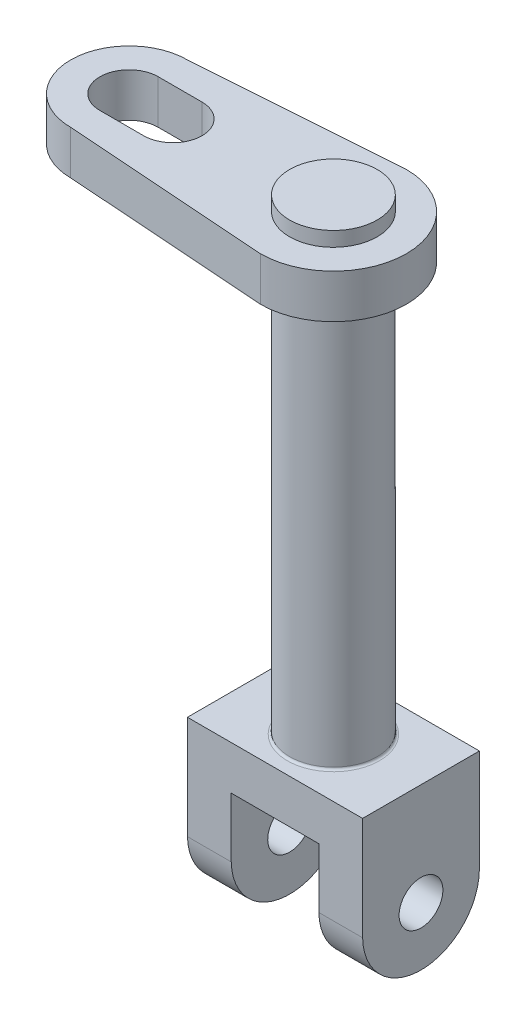
ISO-10303-21;
HEADER;
FILE_DESCRIPTION(('STEP AP214'),'2;1');
FILE_NAME('part.step','',(''),(''),'','','');
FILE_SCHEMA(('AUTOMOTIVE_DESIGN { 1 0 10303 214 1 1 1 1 }'));
ENDSEC;
DATA;
#1=APPLICATION_CONTEXT('core data for automotive mechanical design processes');
#2=APPLICATION_PROTOCOL_DEFINITION('international standard','automotive_design',2000,#1);
#3=PRODUCT_CONTEXT('',#1,'mechanical');
#4=PRODUCT('Part','Part','',(#3));
#5=PRODUCT_RELATED_PRODUCT_CATEGORY('part','',(#4));
#6=PRODUCT_DEFINITION_FORMATION('','',#4);
#7=PRODUCT_DEFINITION_CONTEXT('part definition',#1,'design');
#8=PRODUCT_DEFINITION('design','',#6,#7);
#9=PRODUCT_DEFINITION_SHAPE('','',#8);
#10=(LENGTH_UNIT() NAMED_UNIT(*) SI_UNIT(.MILLI.,.METRE.));
#11=(NAMED_UNIT(*) PLANE_ANGLE_UNIT() SI_UNIT($,.RADIAN.));
#12=(NAMED_UNIT(*) SI_UNIT($,.STERADIAN.) SOLID_ANGLE_UNIT());
#13=UNCERTAINTY_MEASURE_WITH_UNIT(LENGTH_MEASURE(1.E-05),#10,'distance_accuracy_value','');
#14=(GEOMETRIC_REPRESENTATION_CONTEXT(3) GLOBAL_UNCERTAINTY_ASSIGNED_CONTEXT((#13)) GLOBAL_UNIT_ASSIGNED_CONTEXT((#10,
#11,#12)) REPRESENTATION_CONTEXT('',''));
#15=CARTESIAN_POINT('',(0.,0.,0.));
#16=DIRECTION('',(0.,0.,1.));
#17=DIRECTION('',(1.,0.,0.));
#18=AXIS2_PLACEMENT_3D('',#15,#16,#17);
#19=CARTESIAN_POINT('',(15.875,0.,6.34999999999998));
#20=DIRECTION('',(0.,1.,0.));
#21=DIRECTION('',(1.,0.,0.));
#22=AXIS2_PLACEMENT_3D('',#19,#20,#21);
#23=PLANE('',#22);
#24=CARTESIAN_POINT('',(6.34999999999999,0.,-0.000661487155113015));
#25=DIRECTION('',(0.,-1.,0.));
#26=DIRECTION('',(-1.,0.,0.));
#27=AXIS2_PLACEMENT_3D('',#24,#25,#26);
#28=CIRCLE('',#27,3.175);
#29=CARTESIAN_POINT('',(3.17499999999999,0.,-0.00066148715510193));
#30=VERTEX_POINT('',#29);
#31=EDGE_CURVE('E95',#30,#30,#28,.T.);
#32=ORIENTED_EDGE('',*,*,#31,.T.);
#33=EDGE_LOOP('',(#32));
#34=FACE_BOUND('',#33,.T.);
#35=DIRECTION('',(1.,0.,0.));
#36=VECTOR('',#35,1.);
#37=CARTESIAN_POINT('',(-3.17499999999999,0.,6.35000000000005));
#38=LINE('',#37,#36);
#39=CARTESIAN_POINT('',(-3.17499999999999,0.,6.35000000000005));
#40=VERTEX_POINT('',#39);
#41=CARTESIAN_POINT('',(15.875,0.,6.34999999999998));
#42=VERTEX_POINT('',#41);
#43=EDGE_CURVE('E204',#40,#42,#38,.T.);
#44=ORIENTED_EDGE('',*,*,#43,.T.);
#45=DIRECTION('',(0.,0.,1.));
#46=VECTOR('',#45,1.);
#47=CARTESIAN_POINT('',(15.875,0.,-6.35000000000002));
#48=LINE('',#47,#46);
#49=CARTESIAN_POINT('',(15.875,0.,-6.35000000000002));
#50=VERTEX_POINT('',#49);
#51=EDGE_CURVE('E252',#50,#42,#48,.T.);
#52=ORIENTED_EDGE('',*,*,#51,.F.);
#53=DIRECTION('',(1.,0.,0.));
#54=VECTOR('',#53,1.);
#55=CARTESIAN_POINT('',(-3.17500000000003,0.,-6.34999999999995));
#56=LINE('',#55,#54);
#57=CARTESIAN_POINT('',(-3.17500000000003,0.,-6.34999999999995));
#58=VERTEX_POINT('',#57);
#59=EDGE_CURVE('E196',#58,#50,#56,.T.);
#60=ORIENTED_EDGE('',*,*,#59,.F.);
#61=DIRECTION('',(0.,0.,1.));
#62=VECTOR('',#61,1.);
#63=CARTESIAN_POINT('',(-3.17500000000003,0.,-6.34999999999995));
#64=LINE('',#63,#62);
#65=EDGE_CURVE('E249',#58,#40,#64,.T.);
#66=ORIENTED_EDGE('',*,*,#65,.T.);
#67=EDGE_LOOP('',(#44,#52,#60,#66));
#68=FACE_BOUND('',#67,.T.);
#69=ADVANCED_FACE('F92',(#34,#68),#23,.T.);
#70=CARTESIAN_POINT('',(15.875,-11.1125,0.));
#71=DIRECTION('',(-1.,0.,0.));
#72=DIRECTION('',(0.,1.,0.));
#73=AXIS2_PLACEMENT_3D('',#70,#71,#72);
#74=CYLINDRICAL_SURFACE('',#73,2.38125);
#75=CARTESIAN_POINT('',(15.875,-11.1125,0.));
#76=DIRECTION('',(-1.,0.,0.));
#77=DIRECTION('',(0.,1.,0.));
#78=AXIS2_PLACEMENT_3D('',#75,#76,#77);
#79=CIRCLE('',#78,2.38125);
#80=CARTESIAN_POINT('',(15.875,-8.73125000000001,0.));
#81=VERTEX_POINT('',#80);
#82=EDGE_CURVE('E101',#81,#81,#79,.T.);
#83=ORIENTED_EDGE('',*,*,#82,.F.);
#84=EDGE_LOOP('',(#83));
#85=FACE_BOUND('',#84,.T.);
#86=CARTESIAN_POINT('',(11.1125,-11.1125,0.));
#87=DIRECTION('',(1.,0.,0.));
#88=DIRECTION('',(0.,-1.,0.));
#89=AXIS2_PLACEMENT_3D('',#86,#87,#88);
#90=CIRCLE('',#89,2.38125);
#91=CARTESIAN_POINT('',(11.1125,-13.49375,0.));
#92=VERTEX_POINT('',#91);
#93=EDGE_CURVE('E186',#92,#92,#90,.T.);
#94=ORIENTED_EDGE('',*,*,#93,.F.);
#95=EDGE_LOOP('',(#94));
#96=FACE_BOUND('',#95,.T.);
#97=ADVANCED_FACE('F289',(#85,#96),#74,.F.);
#98=CARTESIAN_POINT('',(-3.17500000000001,-11.1125,0.));
#99=DIRECTION('',(1.,0.,0.));
#100=DIRECTION('',(0.,-1.,0.));
#101=AXIS2_PLACEMENT_3D('',#98,#99,#100);
#102=CIRCLE('',#101,2.38125);
#103=CARTESIAN_POINT('',(-3.17500000000002,-13.49375,0.));
#104=VERTEX_POINT('',#103);
#105=EDGE_CURVE('E230',#104,#104,#102,.T.);
#106=ORIENTED_EDGE('',*,*,#105,.F.);
#107=EDGE_LOOP('',(#106));
#108=FACE_BOUND('',#107,.T.);
#109=CARTESIAN_POINT('',(1.58749999999999,-11.1125,0.));
#110=DIRECTION('',(-1.,0.,0.));
#111=DIRECTION('',(0.,1.,0.));
#112=AXIS2_PLACEMENT_3D('',#109,#110,#111);
#113=CIRCLE('',#112,2.38125);
#114=CARTESIAN_POINT('',(1.58749999999999,-8.73125,0.));
#115=VERTEX_POINT('',#114);
#116=EDGE_CURVE('E227',#115,#115,#113,.T.);
#117=ORIENTED_EDGE('',*,*,#116,.F.);
#118=EDGE_LOOP('',(#117));
#119=FACE_BOUND('',#118,.T.);
#120=ADVANCED_FACE('F285',(#108,#119),#74,.F.);
#121=CARTESIAN_POINT('',(-3.17500000000002,-11.1125,0.));
#122=DIRECTION('',(1.,0.,0.));
#123=DIRECTION('',(0.,0.,-1.));
#124=AXIS2_PLACEMENT_3D('',#121,#122,#123);
#125=CYLINDRICAL_SURFACE('',#124,6.35);
#126=CARTESIAN_POINT('',(15.875,-11.1125,0.));
#127=DIRECTION('',(-1.,0.,0.));
#128=DIRECTION('',(0.,1.,0.));
#129=AXIS2_PLACEMENT_3D('',#126,#127,#128);
#130=CIRCLE('',#129,6.35);
#131=CARTESIAN_POINT('',(15.875,-11.1125,-6.35000000000001));
#132=VERTEX_POINT('',#131);
#133=CARTESIAN_POINT('',(15.875,-11.2421149045412,6.34867702568973));
#134=VERTEX_POINT('',#133);
#135=EDGE_CURVE('E108',#132,#134,#130,.T.);
#136=ORIENTED_EDGE('',*,*,#135,.T.);
#137=DIRECTION('',(1.,0.,0.));
#138=VECTOR('',#137,1.);
#139=CARTESIAN_POINT('',(-3.175,-11.2421149045412,6.3486770256898));
#140=LINE('',#139,#138);
#141=CARTESIAN_POINT('',(11.1125,-11.2421149045412,6.34867702568975));
#142=VERTEX_POINT('',#141);
#143=EDGE_CURVE('E216',#142,#134,#140,.T.);
#144=ORIENTED_EDGE('',*,*,#143,.F.);
#145=CARTESIAN_POINT('',(11.1125,-11.1125,0.));
#146=DIRECTION('',(1.,0.,0.));
#147=DIRECTION('',(0.,-1.,0.));
#148=AXIS2_PLACEMENT_3D('',#145,#146,#147);
#149=CIRCLE('',#148,6.35);
#150=CARTESIAN_POINT('',(11.1125,-11.1125,-6.35));
#151=VERTEX_POINT('',#150);
#152=EDGE_CURVE('E177',#142,#151,#149,.T.);
#153=ORIENTED_EDGE('',*,*,#152,.T.);
#154=DIRECTION('',(1.,0.,0.));
#155=VECTOR('',#154,1.);
#156=CARTESIAN_POINT('',(-3.17500000000004,-11.1125,-6.34999999999995));
#157=LINE('',#156,#155);
#158=EDGE_CURVE('E239',#151,#132,#157,.T.);
#159=ORIENTED_EDGE('',*,*,#158,.T.);
#160=EDGE_LOOP('',(#136,#144,#153,#159));
#161=FACE_BOUND('',#160,.T.);
#162=ADVANCED_FACE('F275',(#161),#125,.T.);
#163=CARTESIAN_POINT('',(15.875,0.,-6.35000000000002));
#164=DIRECTION('',(-1.,0.,0.));
#165=DIRECTION('',(0.,1.,0.));
#166=AXIS2_PLACEMENT_3D('',#163,#164,#165);
#167=PLANE('',#166);
#168=ORIENTED_EDGE('',*,*,#82,.T.);
#169=EDGE_LOOP('',(#168));
#170=FACE_BOUND('',#169,.T.);
#171=ORIENTED_EDGE('',*,*,#135,.F.);
#172=DIRECTION('',(0.,-1.,0.));
#173=VECTOR('',#172,1.);
#174=CARTESIAN_POINT('',(15.875,0.,-6.35000000000002));
#175=LINE('',#174,#173);
#176=EDGE_CURVE('E201',#50,#132,#175,.T.);
#177=ORIENTED_EDGE('',*,*,#176,.F.);
#178=ORIENTED_EDGE('',*,*,#51,.T.);
#179=DIRECTION('',(0.,-1.,0.));
#180=VECTOR('',#179,1.);
#181=CARTESIAN_POINT('',(15.875,0.,6.34999999999998));
#182=LINE('',#181,#180);
#183=CARTESIAN_POINT('',(15.875,-11.2421284080888,6.34999999999999));
#184=VERTEX_POINT('',#183);
#185=EDGE_CURVE('E206',#42,#184,#182,.T.);
#186=ORIENTED_EDGE('',*,*,#185,.T.);
#187=DIRECTION('',(0.,0.0102064296172567,-0.999947913040708));
#188=VECTOR('',#187,1.);
#189=CARTESIAN_POINT('',(15.875,-11.1113423974785,-6.46341304147359));
#190=LINE('',#189,#188);
#191=EDGE_CURVE('E176',#184,#134,#190,.T.);
#192=ORIENTED_EDGE('',*,*,#191,.T.);
#193=EDGE_LOOP('',(#171,#177,#178,#186,#192));
#194=FACE_BOUND('',#193,.T.);
#195=ADVANCED_FACE('F272',(#170,#194),#167,.F.);
#196=CARTESIAN_POINT('',(-3.175,-11.2409573020198,6.23526398421621));
#197=DIRECTION('',(0.,0.999947913040708,0.0102064296172567));
#198=DIRECTION('',(0.,-0.0102064296172567,0.999947913040708));
#199=AXIS2_PLACEMENT_3D('',#196,#197,#198);
#200=PLANE('',#199);
#201=DIRECTION('',(1.,0.,0.));
#202=VECTOR('',#201,1.);
#203=CARTESIAN_POINT('',(6.35000000000001,-11.2421284080888,6.35000000000002));
#204=LINE('',#203,#202);
#205=CARTESIAN_POINT('',(11.1125,-11.2421284080888,6.35));
#206=VERTEX_POINT('',#205);
#207=EDGE_CURVE('E241',#206,#184,#204,.T.);
#208=ORIENTED_EDGE('',*,*,#207,.F.);
#209=DIRECTION('',(0.,-0.0102064296172567,0.999947913040708));
#210=VECTOR('',#209,1.);
#211=CARTESIAN_POINT('',(11.1125,-11.1131614871551,-6.28519254772938));
#212=LINE('',#211,#210);
#213=EDGE_CURVE('E209',#142,#206,#212,.T.);
#214=ORIENTED_EDGE('',*,*,#213,.F.);
#215=ORIENTED_EDGE('',*,*,#143,.T.);
#216=ORIENTED_EDGE('',*,*,#191,.F.);
#217=EDGE_LOOP('',(#208,#214,#215,#216));
#218=FACE_BOUND('',#217,.T.);
#219=ADVANCED_FACE('F274',(#218),#200,.F.);
#220=CARTESIAN_POINT('',(11.1125,-17.4625,-6.34999999999999));
#221=DIRECTION('',(1.,0.,0.));
#222=DIRECTION('',(0.,-1.,0.));
#223=AXIS2_PLACEMENT_3D('',#220,#221,#222);
#224=PLANE('',#223);
#225=ORIENTED_EDGE('',*,*,#93,.T.);
#226=EDGE_LOOP('',(#225));
#227=FACE_BOUND('',#226,.T.);
#228=DIRECTION('',(0.,1.,0.));
#229=VECTOR('',#228,1.);
#230=CARTESIAN_POINT('',(11.1125,-17.4625,-6.34999999999999));
#231=LINE('',#230,#229);
#232=CARTESIAN_POINT('',(11.1125,-4.76250000000001,-6.35));
#233=VERTEX_POINT('',#232);
#234=EDGE_CURVE('E194',#151,#233,#231,.T.);
#235=ORIENTED_EDGE('',*,*,#234,.F.);
#236=ORIENTED_EDGE('',*,*,#152,.F.);
#237=ORIENTED_EDGE('',*,*,#213,.T.);
#238=DIRECTION('',(0.,1.,0.));
#239=VECTOR('',#238,1.);
#240=CARTESIAN_POINT('',(11.1125,-17.4625,6.35000000000001));
#241=LINE('',#240,#239);
#242=CARTESIAN_POINT('',(11.1125,-4.7625,6.35));
#243=VERTEX_POINT('',#242);
#244=EDGE_CURVE('E262',#206,#243,#241,.T.);
#245=ORIENTED_EDGE('',*,*,#244,.T.);
#246=DIRECTION('',(0.,0.,1.));
#247=VECTOR('',#246,1.);
#248=CARTESIAN_POINT('',(11.1125,-4.76250000000001,-6.35));
#249=LINE('',#248,#247);
#250=EDGE_CURVE('E244',#233,#243,#249,.T.);
#251=ORIENTED_EDGE('',*,*,#250,.F.);
#252=EDGE_LOOP('',(#235,#236,#237,#245,#251));
#253=FACE_BOUND('',#252,.T.);
#254=ADVANCED_FACE('F281',(#227,#253),#224,.F.);
#255=CARTESIAN_POINT('',(11.1125,-4.76250000000001,-6.35));
#256=DIRECTION('',(0.,1.,0.));
#257=DIRECTION('',(1.,0.,0.));
#258=AXIS2_PLACEMENT_3D('',#255,#256,#257);
#259=PLANE('',#258);
#260=CARTESIAN_POINT('',(6.34999999999999,-4.7625,-0.00066148715511128));
#261=DIRECTION('',(0.,-1.,0.));
#262=DIRECTION('',(-1.,0.,0.));
#263=AXIS2_PLACEMENT_3D('',#260,#261,#262);
#264=CIRCLE('',#263,3.175);
#265=CARTESIAN_POINT('',(3.17499999999999,-4.7625,-0.000661487155100046));
#266=VERTEX_POINT('',#265);
#267=EDGE_CURVE('E14',#266,#266,#264,.T.);
#268=ORIENTED_EDGE('',*,*,#267,.F.);
#269=EDGE_LOOP('',(#268));
#270=FACE_BOUND('',#269,.T.);
#271=DIRECTION('',(-1.,0.,0.));
#272=VECTOR('',#271,1.);
#273=CARTESIAN_POINT('',(11.1125,-4.7625,6.35));
#274=LINE('',#273,#272);
#275=CARTESIAN_POINT('',(1.58750000000002,-4.76249999999999,6.35000000000003));
#276=VERTEX_POINT('',#275);
#277=EDGE_CURVE('E260',#243,#276,#274,.T.);
#278=ORIENTED_EDGE('',*,*,#277,.T.);
#279=DIRECTION('',(0.,0.,1.));
#280=VECTOR('',#279,1.);
#281=CARTESIAN_POINT('',(1.58749999999997,-4.7625,-6.34999999999997));
#282=LINE('',#281,#280);
#283=CARTESIAN_POINT('',(1.58749999999997,-4.7625,-6.34999999999997));
#284=VERTEX_POINT('',#283);
#285=EDGE_CURVE('E247',#284,#276,#282,.T.);
#286=ORIENTED_EDGE('',*,*,#285,.F.);
#287=DIRECTION('',(-1.,0.,0.));
#288=VECTOR('',#287,1.);
#289=CARTESIAN_POINT('',(11.1125,-4.76250000000001,-6.35));
#290=LINE('',#289,#288);
#291=EDGE_CURVE('E190',#233,#284,#290,.T.);
#292=ORIENTED_EDGE('',*,*,#291,.F.);
#293=ORIENTED_EDGE('',*,*,#250,.T.);
#294=EDGE_LOOP('',(#278,#286,#292,#293));
#295=FACE_BOUND('',#294,.T.);
#296=ADVANCED_FACE('F312',(#270,#295),#259,.F.);
#297=CARTESIAN_POINT('',(1.58749999999997,-17.4625,-6.34999999999996));
#298=DIRECTION('',(-1.,0.,0.));
#299=DIRECTION('',(0.,1.,0.));
#300=AXIS2_PLACEMENT_3D('',#297,#298,#299);
#301=PLANE('',#300);
#302=ORIENTED_EDGE('',*,*,#116,.T.);
#303=EDGE_LOOP('',(#302));
#304=FACE_BOUND('',#303,.T.);
#305=CARTESIAN_POINT('',(1.58749999999999,-11.1125,0.));
#306=DIRECTION('',(-1.,0.,0.));
#307=DIRECTION('',(0.,1.,0.));
#308=AXIS2_PLACEMENT_3D('',#305,#306,#307);
#309=CIRCLE('',#308,6.35);
#310=CARTESIAN_POINT('',(1.58749999999997,-11.1125,-6.34999999999996));
#311=VERTEX_POINT('',#310);
#312=CARTESIAN_POINT('',(1.58750000000002,-11.2421149045412,6.34867702568978));
#313=VERTEX_POINT('',#312);
#314=EDGE_CURVE('E166',#311,#313,#309,.T.);
#315=ORIENTED_EDGE('',*,*,#314,.F.);
#316=DIRECTION('',(0.,-1.,0.));
#317=VECTOR('',#316,1.);
#318=CARTESIAN_POINT('',(1.58749999999997,-17.4625,-6.34999999999996));
#319=LINE('',#318,#317);
#320=EDGE_CURVE('E171',#284,#311,#319,.T.);
#321=ORIENTED_EDGE('',*,*,#320,.F.);
#322=ORIENTED_EDGE('',*,*,#285,.T.);
#323=DIRECTION('',(0.,-1.,0.));
#324=VECTOR('',#323,1.);
#325=CARTESIAN_POINT('',(1.58750000000002,-17.4625,6.35000000000004));
#326=LINE('',#325,#324);
#327=CARTESIAN_POINT('',(1.58750000000002,-11.2421284080888,6.35000000000004));
#328=VERTEX_POINT('',#327);
#329=EDGE_CURVE('E258',#276,#328,#326,.T.);
#330=ORIENTED_EDGE('',*,*,#329,.T.);
#331=DIRECTION('',(0.,0.0102064296172567,-0.999947913040708));
#332=VECTOR('',#331,1.);
#333=CARTESIAN_POINT('',(1.58749999999997,-11.1131614871551,-6.28519254772934));
#334=LINE('',#333,#332);
#335=EDGE_CURVE('E173',#328,#313,#334,.T.);
#336=ORIENTED_EDGE('',*,*,#335,.T.);
#337=EDGE_LOOP('',(#315,#321,#322,#330,#336));
#338=FACE_BOUND('',#337,.T.);
#339=ADVANCED_FACE('F168',(#304,#338),#301,.F.);
#340=DIRECTION('',(1.,0.,0.));
#341=VECTOR('',#340,1.);
#342=CARTESIAN_POINT('',(-3.175,-11.2421284080888,6.35000000000005));
#343=LINE('',#342,#341);
#344=CARTESIAN_POINT('',(-3.175,-11.2421284080888,6.35000000000005));
#345=VERTEX_POINT('',#344);
#346=EDGE_CURVE('E213',#345,#328,#343,.T.);
#347=ORIENTED_EDGE('',*,*,#346,.F.);
#348=DIRECTION('',(0.,-0.0102064296172567,0.999947913040708));
#349=VECTOR('',#348,1.);
#350=CARTESIAN_POINT('',(-3.175,-11.2409573020198,6.23526398421621));
#351=LINE('',#350,#349);
#352=CARTESIAN_POINT('',(-3.175,-11.2421149045412,6.3486770256898));
#353=VERTEX_POINT('',#352);
#354=EDGE_CURVE('E219',#353,#345,#351,.T.);
#355=ORIENTED_EDGE('',*,*,#354,.F.);
#356=EDGE_CURVE('E214',#353,#313,#140,.T.);
#357=ORIENTED_EDGE('',*,*,#356,.T.);
#358=ORIENTED_EDGE('',*,*,#335,.F.);
#359=EDGE_LOOP('',(#347,#355,#357,#358));
#360=FACE_BOUND('',#359,.T.);
#361=ADVANCED_FACE('F284',(#360),#200,.F.);
#362=CARTESIAN_POINT('',(-3.17500000000003,0.,-6.34999999999995));
#363=DIRECTION('',(1.,0.,0.));
#364=DIRECTION('',(0.,-1.,0.));
#365=AXIS2_PLACEMENT_3D('',#362,#363,#364);
#366=PLANE('',#365);
#367=ORIENTED_EDGE('',*,*,#105,.T.);
#368=EDGE_LOOP('',(#367));
#369=FACE_BOUND('',#368,.T.);
#370=DIRECTION('',(0.,1.,0.));
#371=VECTOR('',#370,1.);
#372=CARTESIAN_POINT('',(-3.17500000000003,0.,-6.34999999999995));
#373=LINE('',#372,#371);
#374=CARTESIAN_POINT('',(-3.17500000000004,-11.1125,-6.34999999999995));
#375=VERTEX_POINT('',#374);
#376=EDGE_CURVE('E192',#375,#58,#373,.T.);
#377=ORIENTED_EDGE('',*,*,#376,.F.);
#378=CARTESIAN_POINT('',(-3.17500000000002,-11.1125,0.));
#379=DIRECTION('',(1.,0.,0.));
#380=DIRECTION('',(0.,0.,-1.));
#381=AXIS2_PLACEMENT_3D('',#378,#379,#380);
#382=CIRCLE('',#381,6.35);
#383=EDGE_CURVE('E183',#353,#375,#382,.T.);
#384=ORIENTED_EDGE('',*,*,#383,.F.);
#385=ORIENTED_EDGE('',*,*,#354,.T.);
#386=DIRECTION('',(0.,1.,0.));
#387=VECTOR('',#386,1.);
#388=CARTESIAN_POINT('',(-3.17499999999999,0.,6.35000000000005));
#389=LINE('',#388,#387);
#390=EDGE_CURVE('E256',#345,#40,#389,.T.);
#391=ORIENTED_EDGE('',*,*,#390,.T.);
#392=ORIENTED_EDGE('',*,*,#65,.F.);
#393=EDGE_LOOP('',(#377,#384,#385,#391,#392));
#394=FACE_BOUND('',#393,.T.);
#395=ADVANCED_FACE('F326',(#369,#394),#366,.F.);
#396=CARTESIAN_POINT('',(6.35000000000002,0.,6.35000000000002));
#397=DIRECTION('',(0.,0.,-1.));
#398=DIRECTION('',(-1.,0.,0.));
#399=AXIS2_PLACEMENT_3D('',#396,#397,#398);
#400=PLANE('',#399);
#401=ORIENTED_EDGE('',*,*,#390,.F.);
#402=ORIENTED_EDGE('',*,*,#346,.T.);
#403=ORIENTED_EDGE('',*,*,#329,.F.);
#404=ORIENTED_EDGE('',*,*,#277,.F.);
#405=ORIENTED_EDGE('',*,*,#244,.F.);
#406=ORIENTED_EDGE('',*,*,#207,.T.);
#407=ORIENTED_EDGE('',*,*,#185,.F.);
#408=ORIENTED_EDGE('',*,*,#43,.F.);
#409=EDGE_LOOP('',(#401,#402,#403,#404,#405,#406,#407,#408));
#410=FACE_BOUND('',#409,.T.);
#411=ADVANCED_FACE('F322',(#410),#400,.F.);
#412=ORIENTED_EDGE('',*,*,#314,.T.);
#413=ORIENTED_EDGE('',*,*,#356,.F.);
#414=ORIENTED_EDGE('',*,*,#383,.T.);
#415=DIRECTION('',(1.,0.,0.));
#416=VECTOR('',#415,1.);
#417=CARTESIAN_POINT('',(-3.17500000000004,-11.1125,-6.34999999999995));
#418=LINE('',#417,#416);
#419=EDGE_CURVE('E180',#375,#311,#418,.T.);
#420=ORIENTED_EDGE('',*,*,#419,.T.);
#421=EDGE_LOOP('',(#412,#413,#414,#420));
#422=FACE_BOUND('',#421,.T.);
#423=ADVANCED_FACE('F181',(#422),#125,.T.);
#424=CARTESIAN_POINT('',(6.34999999999997,0.,-6.34999999999998));
#425=DIRECTION('',(0.,0.,-1.));
#426=DIRECTION('',(-1.,0.,0.));
#427=AXIS2_PLACEMENT_3D('',#424,#425,#426);
#428=PLANE('',#427);
#429=ORIENTED_EDGE('',*,*,#419,.F.);
#430=ORIENTED_EDGE('',*,*,#376,.T.);
#431=ORIENTED_EDGE('',*,*,#59,.T.);
#432=ORIENTED_EDGE('',*,*,#176,.T.);
#433=ORIENTED_EDGE('',*,*,#158,.F.);
#434=ORIENTED_EDGE('',*,*,#234,.T.);
#435=ORIENTED_EDGE('',*,*,#291,.T.);
#436=ORIENTED_EDGE('',*,*,#320,.T.);
#437=EDGE_LOOP('',(#429,#430,#431,#432,#433,#434,#435,#436));
#438=FACE_BOUND('',#437,.T.);
#439=ADVANCED_FACE('F188',(#438),#428,.T.);
#440=CARTESIAN_POINT('',(6.34999999999999,0.,-0.000661487155113015));
#441=DIRECTION('',(0.,-1.,0.));
#442=DIRECTION('',(-1.,0.,0.));
#443=AXIS2_PLACEMENT_3D('',#440,#441,#442);
#444=CYLINDRICAL_SURFACE('',#443,3.175);
#445=CARTESIAN_POINT('',(3.17499999999999,0.,-0.00066148715510193));
#446=CARTESIAN_POINT('',(3.17499999999999,-0.0496093749999975,-0.00066148715510191));
#447=CARTESIAN_POINT('',(3.17499999999999,-0.0992187499999975,-0.00066148715510189));
#448=CARTESIAN_POINT('',(3.17499999999999,-0.198437499999997,-0.000661487155101851));
#449=CARTESIAN_POINT('',(3.17499999999999,-0.248046874999998,-0.000661487155101831));
#450=CARTESIAN_POINT('',(3.17499999999999,-0.347265624999998,-0.000661487155101792));
#451=CARTESIAN_POINT('',(3.17499999999999,-0.396874999999998,-0.000661487155101773));
#452=CARTESIAN_POINT('',(3.17499999999999,-0.496093749999998,-0.000661487155101733));
#453=CARTESIAN_POINT('',(3.17499999999999,-0.545703124999998,-0.000661487155101714));
#454=CARTESIAN_POINT('',(3.17499999999999,-0.644921874999998,-0.000661487155101674));
#455=CARTESIAN_POINT('',(3.17499999999999,-0.694531249999998,-0.000661487155101655));
#456=CARTESIAN_POINT('',(3.17499999999999,-0.793749999999998,-0.000661487155101616));
#457=CARTESIAN_POINT('',(3.17499999999999,-0.843359374999998,-0.000661487155101596));
#458=CARTESIAN_POINT('',(3.17499999999999,-0.942578124999998,-0.000661487155101557));
#459=CARTESIAN_POINT('',(3.17499999999999,-0.992187499999997,-0.000661487155101537));
#460=CARTESIAN_POINT('',(3.17499999999999,-1.09140625,-0.000661487155101498));
#461=CARTESIAN_POINT('',(3.17499999999999,-1.141015625,-0.000661487155101478));
#462=CARTESIAN_POINT('',(3.17499999999999,-1.240234375,-0.000661487155101439));
#463=CARTESIAN_POINT('',(3.17499999999999,-1.28984375,-0.000661487155101419));
#464=CARTESIAN_POINT('',(3.17499999999999,-1.3890625,-0.00066148715510138));
#465=CARTESIAN_POINT('',(3.17499999999999,-1.438671875,-0.00066148715510136));
#466=CARTESIAN_POINT('',(3.17499999999999,-1.537890625,-0.000661487155101321));
#467=CARTESIAN_POINT('',(3.17499999999999,-1.5875,-0.000661487155101301));
#468=CARTESIAN_POINT('',(3.17499999999999,-1.68671875,-0.000661487155101262));
#469=CARTESIAN_POINT('',(3.17499999999999,-1.736328125,-0.000661487155101243));
#470=CARTESIAN_POINT('',(3.17499999999999,-1.835546875,-0.000661487155101203));
#471=CARTESIAN_POINT('',(3.17499999999999,-1.88515625,-0.000661487155101184));
#472=CARTESIAN_POINT('',(3.17499999999999,-1.984375,-0.000661487155101145));
#473=CARTESIAN_POINT('',(3.17499999999999,-2.033984375,-0.000661487155101125));
#474=CARTESIAN_POINT('',(3.17499999999999,-2.133203125,-0.000661487155101086));
#475=CARTESIAN_POINT('',(3.17499999999999,-2.1828125,-0.000661487155101066));
#476=CARTESIAN_POINT('',(3.17499999999999,-2.28203125,-0.000661487155101027));
#477=CARTESIAN_POINT('',(3.17499999999999,-2.331640625,-0.000661487155101007));
#478=CARTESIAN_POINT('',(3.17499999999999,-2.430859375,-0.000661487155100968));
#479=CARTESIAN_POINT('',(3.17499999999999,-2.48046875,-0.000661487155100948));
#480=CARTESIAN_POINT('',(3.17499999999999,-2.5796875,-0.000661487155100909));
#481=CARTESIAN_POINT('',(3.17499999999999,-2.629296875,-0.000661487155100889));
#482=CARTESIAN_POINT('',(3.17499999999999,-2.728515625,-0.00066148715510085));
#483=CARTESIAN_POINT('',(3.17499999999999,-2.778125,-0.00066148715510083));
#484=CARTESIAN_POINT('',(3.17499999999999,-2.87734375,-0.000661487155100791));
#485=CARTESIAN_POINT('',(3.17499999999999,-2.926953125,-0.000661487155100772));
#486=CARTESIAN_POINT('',(3.17499999999999,-3.026171875,-0.000661487155100732));
#487=CARTESIAN_POINT('',(3.17499999999999,-3.07578125,-0.000661487155100713));
#488=CARTESIAN_POINT('',(3.17499999999999,-3.175,-0.000661487155100674));
#489=CARTESIAN_POINT('',(3.17499999999999,-3.224609375,-0.000661487155100654));
#490=CARTESIAN_POINT('',(3.17499999999999,-3.323828125,-0.000661487155100615));
#491=CARTESIAN_POINT('',(3.17499999999999,-3.3734375,-0.000661487155100595));
#492=CARTESIAN_POINT('',(3.17499999999999,-3.47265625,-0.000661487155100556));
#493=CARTESIAN_POINT('',(3.17499999999999,-3.522265625,-0.000661487155100536));
#494=CARTESIAN_POINT('',(3.17499999999999,-3.621484375,-0.000661487155100497));
#495=CARTESIAN_POINT('',(3.17499999999999,-3.67109375,-0.000661487155100477));
#496=CARTESIAN_POINT('',(3.17499999999999,-3.7703125,-0.000661487155100438));
#497=CARTESIAN_POINT('',(3.17499999999999,-3.819921875,-0.000661487155100418));
#498=CARTESIAN_POINT('',(3.17499999999999,-3.919140625,-0.000661487155100379));
#499=CARTESIAN_POINT('',(3.17499999999999,-3.96875,-0.00066148715510036));
#500=CARTESIAN_POINT('',(3.17499999999999,-4.06796875,-0.00066148715510032));
#501=CARTESIAN_POINT('',(3.17499999999999,-4.117578125,-0.000661487155100301));
#502=CARTESIAN_POINT('',(3.17499999999999,-4.216796875,-0.000661487155100261));
#503=CARTESIAN_POINT('',(3.17499999999999,-4.26640625,-0.000661487155100242));
#504=CARTESIAN_POINT('',(3.17499999999999,-4.365625,-0.000661487155100202));
#505=CARTESIAN_POINT('',(3.17499999999999,-4.415234375,-0.000661487155100183));
#506=CARTESIAN_POINT('',(3.17499999999999,-4.514453125,-0.000661487155100144));
#507=CARTESIAN_POINT('',(3.17499999999999,-4.5640625,-0.000661487155100124));
#508=CARTESIAN_POINT('',(3.17499999999999,-4.66328125,-0.000661487155100085));
#509=CARTESIAN_POINT('',(3.17499999999999,-4.712890625,-0.000661487155100065));
#510=CARTESIAN_POINT('',(3.17499999999999,-4.7625,-0.000661487155100046));
#511=B_SPLINE_CURVE_WITH_KNOTS('',3,(#445,#446,#447,#448,#449,#450,#451,#452,#453,#454,#455,
#456,#457,#458,#459,#460,#461,#462,#463,#464,#465,#466,#467,#468,#469,#470,#471,#472,#473,#474,
#475,#476,#477,#478,#479,#480,#481,#482,#483,#484,#485,#486,#487,#488,#489,#490,#491,#492,#493,
#494,#495,#496,#497,#498,#499,#500,#501,#502,#503,#504,#505,#506,#507,#508,#509,#510),
.UNSPECIFIED.,.F.,.F.,(4,2,2,2,2,2,2,2,2,2,2,2,2,2,2,2,2,2,2,2,2,2,2,2,2,2,2,2,2,2,2,2,4),(0.,
0.148828125,0.29765625,0.446484375,0.5953125,0.744140625,0.89296875,1.041796875,1.190625,
1.339453125,1.48828125,1.637109375,1.7859375,1.934765625,2.08359375,2.232421875,2.38125,
2.530078125,2.67890625,2.827734375,2.9765625,3.125390625,3.27421875,3.423046875,3.571875,
3.720703125,3.86953125,4.018359375,4.1671875,4.316015625,4.46484375,4.613671875,4.7625),.UNSPECIFIED.);
#512=EDGE_CURVE('BSEAM299',#30,#266,#511,.T.);
#513=ORIENTED_EDGE('',*,*,#31,.F.);
#514=ORIENTED_EDGE('',*,*,#267,.T.);
#515=ORIENTED_EDGE('',*,*,#512,.T.);
#516=ORIENTED_EDGE('',*,*,#512,.F.);
#517=EDGE_LOOP('',(#513,#515,#514,#516));
#518=FACE_BOUND('',#517,.T.);
#519=ADVANCED_FACE('F299',(#518),#444,.F.);
#520=CLOSED_SHELL('',(#69,#97,#120,#162,#195,#219,#254,#296,#339,#361,#395,#411,#423,#439,#519));
#521=MANIFOLD_SOLID_BREP('B2',#520);
#522=CARTESIAN_POINT('',(6.35,50.8,0.));
#523=DIRECTION('',(0.,1.,0.));
#524=DIRECTION('',(0.,0.,1.));
#525=AXIS2_PLACEMENT_3D('',#522,#523,#524);
#526=PLANE('',#525);
#527=CARTESIAN_POINT('',(6.35,50.8,0.));
#528=DIRECTION('',(0.,1.,0.));
#529=DIRECTION('',(0.,0.,1.));
#530=AXIS2_PLACEMENT_3D('',#527,#528,#529);
#531=CIRCLE('',#530,4.7625);
#532=CARTESIAN_POINT('',(6.35,50.8,4.7625));
#533=VERTEX_POINT('',#532);
#534=EDGE_CURVE('E544',#533,#533,#531,.T.);
#535=ORIENTED_EDGE('',*,*,#534,.T.);
#536=EDGE_LOOP('',(#535));
#537=FACE_BOUND('',#536,.T.);
#538=ADVANCED_FACE('F442',(#537),#526,.T.);
#539=CARTESIAN_POINT('',(6.35,50.8,0.));
#540=DIRECTION('',(0.,-1.,0.));
#541=DIRECTION('',(0.,0.,-1.));
#542=AXIS2_PLACEMENT_3D('',#539,#540,#541);
#543=CYLINDRICAL_SURFACE('',#542,4.7625);
#544=ORIENTED_EDGE('',*,*,#534,.F.);
#545=EDGE_LOOP('',(#544));
#546=FACE_BOUND('',#545,.T.);
#547=CARTESIAN_POINT('',(6.35,49.2125,0.));
#548=DIRECTION('',(0.,1.,0.));
#549=DIRECTION('',(0.,0.,1.));
#550=AXIS2_PLACEMENT_3D('',#547,#548,#549);
#551=CIRCLE('',#550,4.7625);
#552=CARTESIAN_POINT('',(6.35,49.2125,4.7625));
#553=VERTEX_POINT('',#552);
#554=EDGE_CURVE('E659',#553,#553,#551,.T.);
#555=ORIENTED_EDGE('',*,*,#554,.T.);
#556=EDGE_LOOP('',(#555));
#557=FACE_BOUND('',#556,.T.);
#558=ADVANCED_FACE('F607',(#546,#557),#543,.T.);
#559=CARTESIAN_POINT('',(0.,49.2125,0.));
#560=DIRECTION('',(0.,1.,0.));
#561=DIRECTION('',(0.,0.,1.));
#562=AXIS2_PLACEMENT_3D('',#559,#560,#561);
#563=PLANE('',#562);
#564=ORIENTED_EDGE('',*,*,#554,.F.);
#565=EDGE_LOOP('',(#564));
#566=FACE_BOUND('',#565,.T.);
#567=CARTESIAN_POINT('',(-15.875,49.2125,0.));
#568=DIRECTION('',(0.,1.,0.));
#569=DIRECTION('',(0.,0.,1.));
#570=AXIS2_PLACEMENT_3D('',#567,#568,#569);
#571=CIRCLE('',#570,3.175);
#572=CARTESIAN_POINT('',(-15.875,49.2125,-3.175));
#573=VERTEX_POINT('',#572);
#574=CARTESIAN_POINT('',(-15.875,49.2125,3.175));
#575=VERTEX_POINT('',#574);
#576=EDGE_CURVE('E561',#573,#575,#571,.T.);
#577=ORIENTED_EDGE('',*,*,#576,.F.);
#578=DIRECTION('',(-1.,0.,0.));
#579=VECTOR('',#578,1.);
#580=CARTESIAN_POINT('',(0.,49.2125,-3.17500000000001));
#581=LINE('',#580,#579);
#582=CARTESIAN_POINT('',(-11.1125,49.2125,-3.175));
#583=VERTEX_POINT('',#582);
#584=EDGE_CURVE('E647',#583,#573,#581,.T.);
#585=ORIENTED_EDGE('',*,*,#584,.F.);
#586=CARTESIAN_POINT('',(-11.1125,49.2125,0.));
#587=DIRECTION('',(0.,1.,0.));
#588=DIRECTION('',(0.,0.,1.));
#589=AXIS2_PLACEMENT_3D('',#586,#587,#588);
#590=CIRCLE('',#589,3.175);
#591=CARTESIAN_POINT('',(-11.1125,49.2125,3.175));
#592=VERTEX_POINT('',#591);
#593=EDGE_CURVE('E651',#592,#583,#590,.T.);
#594=ORIENTED_EDGE('',*,*,#593,.F.);
#595=DIRECTION('',(-1.,0.,0.));
#596=VECTOR('',#595,1.);
#597=CARTESIAN_POINT('',(0.,49.2125,3.175));
#598=LINE('',#597,#596);
#599=EDGE_CURVE('E653',#592,#575,#598,.T.);
#600=ORIENTED_EDGE('',*,*,#599,.T.);
#601=EDGE_LOOP('',(#577,#585,#594,#600));
#602=FACE_BOUND('',#601,.T.);
#603=DIRECTION('',(0.997458699830735,0.,-0.0712470499879097));
#604=VECTOR('',#603,1.);
#605=CARTESIAN_POINT('',(-0.531852791878173,49.2125,-7.44593908629442));
#606=LINE('',#605,#604);
#607=CARTESIAN_POINT('',(-15.875,49.2125,-6.35));
#608=VERTEX_POINT('',#607);
#609=CARTESIAN_POINT('',(6.35,49.2125,-7.9375));
#610=VERTEX_POINT('',#609);
#611=EDGE_CURVE('E521',#608,#610,#606,.T.);
#612=ORIENTED_EDGE('',*,*,#611,.F.);
#613=CARTESIAN_POINT('',(-15.875,49.2125,0.));
#614=DIRECTION('',(0.,1.,0.));
#615=DIRECTION('',(0.,0.,1.));
#616=AXIS2_PLACEMENT_3D('',#613,#614,#615);
#617=CIRCLE('',#616,6.35);
#618=CARTESIAN_POINT('',(-15.875,49.2125,6.35));
#619=VERTEX_POINT('',#618);
#620=EDGE_CURVE('E516',#608,#619,#617,.T.);
#621=ORIENTED_EDGE('',*,*,#620,.T.);
#622=DIRECTION('',(-0.997458699830735,0.,-0.0712470499879095));
#623=VECTOR('',#622,1.);
#624=CARTESIAN_POINT('',(-0.531852791878172,49.2125,7.44593908629442));
#625=LINE('',#624,#623);
#626=CARTESIAN_POINT('',(6.35,49.2125,7.9375));
#627=VERTEX_POINT('',#626);
#628=EDGE_CURVE('E520',#627,#619,#625,.T.);
#629=ORIENTED_EDGE('',*,*,#628,.F.);
#630=CARTESIAN_POINT('',(6.35,49.2125,0.));
#631=DIRECTION('',(0.,1.,0.));
#632=DIRECTION('',(0.,0.,1.));
#633=AXIS2_PLACEMENT_3D('',#630,#631,#632);
#634=CIRCLE('',#633,7.9375);
#635=EDGE_CURVE('E459',#627,#610,#634,.T.);
#636=ORIENTED_EDGE('',*,*,#635,.T.);
#637=EDGE_LOOP('',(#612,#621,#629,#636));
#638=FACE_BOUND('',#637,.T.);
#639=ADVANCED_FACE('F518',(#566,#602,#638),#563,.T.);
#640=CARTESIAN_POINT('',(-15.875,49.2125,0.));
#641=DIRECTION('',(0.,-1.,0.));
#642=DIRECTION('',(0.,0.,-1.));
#643=AXIS2_PLACEMENT_3D('',#640,#641,#642);
#644=CYLINDRICAL_SURFACE('',#643,6.35);
#645=CARTESIAN_POINT('',(-15.875,44.45,0.));
#646=DIRECTION('',(0.,1.,0.));
#647=DIRECTION('',(0.,0.,1.));
#648=AXIS2_PLACEMENT_3D('',#645,#646,#647);
#649=CIRCLE('',#648,6.35);
#650=CARTESIAN_POINT('',(-15.875,44.45,-6.35));
#651=VERTEX_POINT('',#650);
#652=CARTESIAN_POINT('',(-15.875,44.45,6.35));
#653=VERTEX_POINT('',#652);
#654=EDGE_CURVE('E528',#651,#653,#649,.T.);
#655=ORIENTED_EDGE('',*,*,#654,.T.);
#656=DIRECTION('',(0.,-1.,0.));
#657=VECTOR('',#656,1.);
#658=CARTESIAN_POINT('',(-15.875,49.2125,6.35));
#659=LINE('',#658,#657);
#660=EDGE_CURVE('E525',#619,#653,#659,.T.);
#661=ORIENTED_EDGE('',*,*,#660,.F.);
#662=ORIENTED_EDGE('',*,*,#620,.F.);
#663=DIRECTION('',(0.,-1.,0.));
#664=VECTOR('',#663,1.);
#665=CARTESIAN_POINT('',(-15.875,49.2125,-6.35));
#666=LINE('',#665,#664);
#667=EDGE_CURVE('E532',#608,#651,#666,.T.);
#668=ORIENTED_EDGE('',*,*,#667,.T.);
#669=EDGE_LOOP('',(#655,#661,#662,#668));
#670=FACE_BOUND('',#669,.T.);
#671=ADVANCED_FACE('F526',(#670),#644,.T.);
#672=CARTESIAN_POINT('',(-0.531852791878172,49.2125,7.44593908629442));
#673=DIRECTION('',(-0.0712470499879096,0.,0.997458699830735));
#674=DIRECTION('',(0.997458699830735,0.,0.0712470499879096));
#675=AXIS2_PLACEMENT_3D('',#672,#673,#674);
#676=PLANE('',#675);
#677=DIRECTION('',(-0.997458699830735,0.,-0.0712470499879095));
#678=VECTOR('',#677,1.);
#679=CARTESIAN_POINT('',(-0.531852791878172,44.45,7.44593908629442));
#680=LINE('',#679,#678);
#681=CARTESIAN_POINT('',(6.35,44.45,7.9375));
#682=VERTEX_POINT('',#681);
#683=EDGE_CURVE('E557',#682,#653,#680,.T.);
#684=ORIENTED_EDGE('',*,*,#683,.F.);
#685=DIRECTION('',(0.,-1.,0.));
#686=VECTOR('',#685,1.);
#687=CARTESIAN_POINT('',(6.35,49.2125,7.9375));
#688=LINE('',#687,#686);
#689=EDGE_CURVE('E487',#627,#682,#688,.T.);
#690=ORIENTED_EDGE('',*,*,#689,.F.);
#691=ORIENTED_EDGE('',*,*,#628,.T.);
#692=ORIENTED_EDGE('',*,*,#660,.T.);
#693=EDGE_LOOP('',(#684,#690,#691,#692));
#694=FACE_BOUND('',#693,.T.);
#695=ADVANCED_FACE('F534',(#694),#676,.T.);
#696=CARTESIAN_POINT('',(6.35,49.2125,0.));
#697=DIRECTION('',(0.,-1.,0.));
#698=DIRECTION('',(0.,0.,-1.));
#699=AXIS2_PLACEMENT_3D('',#696,#697,#698);
#700=CYLINDRICAL_SURFACE('',#699,7.9375);
#701=CARTESIAN_POINT('',(6.35,44.45,0.));
#702=DIRECTION('',(0.,1.,0.));
#703=DIRECTION('',(0.,0.,1.));
#704=AXIS2_PLACEMENT_3D('',#701,#702,#703);
#705=CIRCLE('',#704,7.9375);
#706=CARTESIAN_POINT('',(6.35,44.45,-7.9375));
#707=VERTEX_POINT('',#706);
#708=EDGE_CURVE('E559',#682,#707,#705,.T.);
#709=ORIENTED_EDGE('',*,*,#708,.T.);
#710=DIRECTION('',(0.,-1.,0.));
#711=VECTOR('',#710,1.);
#712=CARTESIAN_POINT('',(6.35,49.2125,-7.9375));
#713=LINE('',#712,#711);
#714=EDGE_CURVE('E494',#610,#707,#713,.T.);
#715=ORIENTED_EDGE('',*,*,#714,.F.);
#716=ORIENTED_EDGE('',*,*,#635,.F.);
#717=ORIENTED_EDGE('',*,*,#689,.T.);
#718=EDGE_LOOP('',(#709,#715,#716,#717));
#719=FACE_BOUND('',#718,.T.);
#720=ADVANCED_FACE('F615',(#719),#700,.T.);
#721=CARTESIAN_POINT('',(-0.531852791878173,49.2125,-7.44593908629442));
#722=DIRECTION('',(-0.0712470499879097,0.,-0.997458699830735));
#723=DIRECTION('',(-0.997458699830735,0.,0.0712470499879097));
#724=AXIS2_PLACEMENT_3D('',#721,#722,#723);
#725=PLANE('',#724);
#726=DIRECTION('',(0.997458699830735,0.,-0.0712470499879097));
#727=VECTOR('',#726,1.);
#728=CARTESIAN_POINT('',(-0.531852791878173,44.45,-7.44593908629442));
#729=LINE('',#728,#727);
#730=EDGE_CURVE('E553',#651,#707,#729,.T.);
#731=ORIENTED_EDGE('',*,*,#730,.F.);
#732=ORIENTED_EDGE('',*,*,#667,.F.);
#733=ORIENTED_EDGE('',*,*,#611,.T.);
#734=ORIENTED_EDGE('',*,*,#714,.T.);
#735=EDGE_LOOP('',(#731,#732,#733,#734));
#736=FACE_BOUND('',#735,.T.);
#737=ADVANCED_FACE('F618',(#736),#725,.T.);
#738=CARTESIAN_POINT('',(0.,49.2125,-3.17500000000001));
#739=DIRECTION('',(0.,0.,1.));
#740=DIRECTION('',(1.,0.,0.));
#741=AXIS2_PLACEMENT_3D('',#738,#739,#740);
#742=PLANE('',#741);
#743=DIRECTION('',(-1.,0.,0.));
#744=VECTOR('',#743,1.);
#745=CARTESIAN_POINT('',(0.,44.45,-3.17500000000001));
#746=LINE('',#745,#744);
#747=CARTESIAN_POINT('',(-11.1125,44.45,-3.175));
#748=VERTEX_POINT('',#747);
#749=CARTESIAN_POINT('',(-15.875,44.45,-3.175));
#750=VERTEX_POINT('',#749);
#751=EDGE_CURVE('E543',#748,#750,#746,.T.);
#752=ORIENTED_EDGE('',*,*,#751,.F.);
#753=DIRECTION('',(0.,-1.,0.));
#754=VECTOR('',#753,1.);
#755=CARTESIAN_POINT('',(-11.1125,49.2125,-3.175));
#756=LINE('',#755,#754);
#757=EDGE_CURVE('E569',#583,#748,#756,.T.);
#758=ORIENTED_EDGE('',*,*,#757,.F.);
#759=ORIENTED_EDGE('',*,*,#584,.T.);
#760=DIRECTION('',(0.,-1.,0.));
#761=VECTOR('',#760,1.);
#762=CARTESIAN_POINT('',(-15.875,49.2125,-3.175));
#763=LINE('',#762,#761);
#764=EDGE_CURVE('E501',#573,#750,#763,.T.);
#765=ORIENTED_EDGE('',*,*,#764,.T.);
#766=EDGE_LOOP('',(#752,#758,#759,#765));
#767=FACE_BOUND('',#766,.T.);
#768=ADVANCED_FACE('F625',(#767),#742,.T.);
#769=CARTESIAN_POINT('',(-11.1125,49.2125,0.));
#770=DIRECTION('',(0.,-1.,0.));
#771=DIRECTION('',(0.,0.,-1.));
#772=AXIS2_PLACEMENT_3D('',#769,#770,#771);
#773=CYLINDRICAL_SURFACE('',#772,3.175);
#774=CARTESIAN_POINT('',(-11.1125,44.45,0.));
#775=DIRECTION('',(0.,1.,0.));
#776=DIRECTION('',(0.,0.,1.));
#777=AXIS2_PLACEMENT_3D('',#774,#775,#776);
#778=CIRCLE('',#777,3.175);
#779=CARTESIAN_POINT('',(-11.1125,44.45,3.175));
#780=VERTEX_POINT('',#779);
#781=EDGE_CURVE('E547',#780,#748,#778,.T.);
#782=ORIENTED_EDGE('',*,*,#781,.F.);
#783=DIRECTION('',(0.,-1.,0.));
#784=VECTOR('',#783,1.);
#785=CARTESIAN_POINT('',(-11.1125,49.2125,3.175));
#786=LINE('',#785,#784);
#787=EDGE_CURVE('E567',#592,#780,#786,.T.);
#788=ORIENTED_EDGE('',*,*,#787,.F.);
#789=ORIENTED_EDGE('',*,*,#593,.T.);
#790=ORIENTED_EDGE('',*,*,#757,.T.);
#791=EDGE_LOOP('',(#782,#788,#789,#790));
#792=FACE_BOUND('',#791,.T.);
#793=ADVANCED_FACE('F629',(#792),#773,.F.);
#794=CARTESIAN_POINT('',(0.,49.2125,3.175));
#795=DIRECTION('',(0.,0.,1.));
#796=DIRECTION('',(1.,0.,0.));
#797=AXIS2_PLACEMENT_3D('',#794,#795,#796);
#798=PLANE('',#797);
#799=DIRECTION('',(-1.,0.,0.));
#800=VECTOR('',#799,1.);
#801=CARTESIAN_POINT('',(0.,44.45,3.175));
#802=LINE('',#801,#800);
#803=CARTESIAN_POINT('',(-15.875,44.45,3.175));
#804=VERTEX_POINT('',#803);
#805=EDGE_CURVE('E550',#780,#804,#802,.T.);
#806=ORIENTED_EDGE('',*,*,#805,.T.);
#807=DIRECTION('',(0.,-1.,0.));
#808=VECTOR('',#807,1.);
#809=CARTESIAN_POINT('',(-15.875,49.2125,3.175));
#810=LINE('',#809,#808);
#811=EDGE_CURVE('E536',#575,#804,#810,.T.);
#812=ORIENTED_EDGE('',*,*,#811,.F.);
#813=ORIENTED_EDGE('',*,*,#599,.F.);
#814=ORIENTED_EDGE('',*,*,#787,.T.);
#815=EDGE_LOOP('',(#806,#812,#813,#814));
#816=FACE_BOUND('',#815,.T.);
#817=ADVANCED_FACE('F626',(#816),#798,.F.);
#818=CARTESIAN_POINT('',(-15.875,49.2125,0.));
#819=DIRECTION('',(0.,-1.,0.));
#820=DIRECTION('',(0.,0.,-1.));
#821=AXIS2_PLACEMENT_3D('',#818,#819,#820);
#822=CYLINDRICAL_SURFACE('',#821,3.175);
#823=CARTESIAN_POINT('',(-15.875,44.45,0.));
#824=DIRECTION('',(0.,1.,0.));
#825=DIRECTION('',(0.,0.,1.));
#826=AXIS2_PLACEMENT_3D('',#823,#824,#825);
#827=CIRCLE('',#826,3.175);
#828=EDGE_CURVE('E540',#750,#804,#827,.T.);
#829=ORIENTED_EDGE('',*,*,#828,.F.);
#830=ORIENTED_EDGE('',*,*,#764,.F.);
#831=ORIENTED_EDGE('',*,*,#576,.T.);
#832=ORIENTED_EDGE('',*,*,#811,.T.);
#833=EDGE_LOOP('',(#829,#830,#831,#832));
#834=FACE_BOUND('',#833,.T.);
#835=ADVANCED_FACE('F593',(#834),#822,.F.);
#836=CARTESIAN_POINT('',(0.,44.45,0.));
#837=DIRECTION('',(0.,1.,0.));
#838=DIRECTION('',(0.,0.,1.));
#839=AXIS2_PLACEMENT_3D('',#836,#837,#838);
#840=PLANE('',#839);
#841=CARTESIAN_POINT('',(6.35,44.45,0.));
#842=DIRECTION('',(0.,1.,0.));
#843=DIRECTION('',(0.,0.,1.));
#844=AXIS2_PLACEMENT_3D('',#841,#842,#843);
#845=CIRCLE('',#844,5.0165);
#846=CARTESIAN_POINT('',(6.35,44.45,5.0165));
#847=VERTEX_POINT('',#846);
#848=EDGE_CURVE('E446',#847,#847,#845,.T.);
#849=ORIENTED_EDGE('',*,*,#848,.T.);
#850=EDGE_LOOP('',(#849));
#851=FACE_BOUND('',#850,.T.);
#852=ORIENTED_EDGE('',*,*,#828,.T.);
#853=ORIENTED_EDGE('',*,*,#805,.F.);
#854=ORIENTED_EDGE('',*,*,#781,.T.);
#855=ORIENTED_EDGE('',*,*,#751,.T.);
#856=EDGE_LOOP('',(#852,#853,#854,#855));
#857=FACE_BOUND('',#856,.T.);
#858=ORIENTED_EDGE('',*,*,#730,.T.);
#859=ORIENTED_EDGE('',*,*,#708,.F.);
#860=ORIENTED_EDGE('',*,*,#683,.T.);
#861=ORIENTED_EDGE('',*,*,#654,.F.);
#862=EDGE_LOOP('',(#858,#859,#860,#861));
#863=FACE_BOUND('',#862,.T.);
#864=ADVANCED_FACE('F581',(#851,#857,#863),#840,.F.);
#865=CARTESIAN_POINT('',(6.35,44.196,0.));
#866=DIRECTION('',(0.,1.,0.));
#867=DIRECTION('',(0.,0.,1.));
#868=AXIS2_PLACEMENT_3D('',#865,#866,#867);
#869=TOROIDAL_SURFACE('',#868,5.0165,0.254);
#870=CARTESIAN_POINT('',(6.35,44.196,0.));
#871=DIRECTION('',(0.,1.,0.));
#872=DIRECTION('',(0.,0.,1.));
#873=AXIS2_PLACEMENT_3D('',#870,#871,#872);
#874=CIRCLE('',#873,4.7625);
#875=CARTESIAN_POINT('',(6.35,44.196,4.7625));
#876=VERTEX_POINT('',#875);
#877=EDGE_CURVE('E565',#876,#876,#874,.F.);
#878=ORIENTED_EDGE('',*,*,#877,.F.);
#879=EDGE_LOOP('',(#878));
#880=FACE_BOUND('',#879,.T.);
#881=ORIENTED_EDGE('',*,*,#848,.F.);
#882=EDGE_LOOP('',(#881));
#883=FACE_BOUND('',#882,.T.);
#884=ADVANCED_FACE('F444',(#880,#883),#869,.F.);
#885=CARTESIAN_POINT('',(6.35,44.45,0.));
#886=DIRECTION('',(0.,-1.,0.));
#887=DIRECTION('',(0.,0.,-1.));
#888=AXIS2_PLACEMENT_3D('',#885,#886,#887);
#889=CYLINDRICAL_SURFACE('',#888,4.7625);
#890=CARTESIAN_POINT('',(6.35,0.253999999999997,0.));
#891=DIRECTION('',(0.,-1.,0.));
#892=DIRECTION('',(0.,0.,-1.));
#893=AXIS2_PLACEMENT_3D('',#890,#891,#892);
#894=CIRCLE('',#893,4.7625);
#895=CARTESIAN_POINT('',(6.35,0.253999999999997,-4.7625));
#896=VERTEX_POINT('',#895);
#897=EDGE_CURVE('E574',#896,#896,#894,.F.);
#898=ORIENTED_EDGE('',*,*,#897,.T.);
#899=EDGE_LOOP('',(#898));
#900=FACE_BOUND('',#899,.T.);
#901=ORIENTED_EDGE('',*,*,#877,.T.);
#902=EDGE_LOOP('',(#901));
#903=FACE_BOUND('',#902,.T.);
#904=ADVANCED_FACE('F585',(#900,#903),#889,.T.);
#905=CARTESIAN_POINT('',(6.35,0.253999999999997,0.));
#906=DIRECTION('',(0.,-1.,0.));
#907=DIRECTION('',(0.,0.,-1.));
#908=AXIS2_PLACEMENT_3D('',#905,#906,#907);
#909=TOROIDAL_SURFACE('',#908,5.0165,0.254);
#910=CARTESIAN_POINT('',(6.35,0.,0.));
#911=DIRECTION('',(0.,-1.,0.));
#912=DIRECTION('',(0.,0.,-1.));
#913=AXIS2_PLACEMENT_3D('',#910,#911,#912);
#914=CIRCLE('',#913,5.0165);
#915=CARTESIAN_POINT('',(6.35,0.,-5.0165));
#916=VERTEX_POINT('',#915);
#917=EDGE_CURVE('E90',#916,#916,#914,.T.);
#918=ORIENTED_EDGE('',*,*,#917,.F.);
#919=EDGE_LOOP('',(#918));
#920=FACE_BOUND('',#919,.T.);
#921=ORIENTED_EDGE('',*,*,#897,.F.);
#922=EDGE_LOOP('',(#921));
#923=FACE_BOUND('',#922,.T.);
#924=ADVANCED_FACE('F591',(#920,#923),#909,.F.);
#925=CARTESIAN_POINT('',(6.35066148715513,0.,0.));
#926=DIRECTION('',(0.,-1.,0.));
#927=DIRECTION('',(0.,0.,-1.));
#928=AXIS2_PLACEMENT_3D('',#925,#926,#927);
#929=PLANE('',#928);
#930=ORIENTED_EDGE('',*,*,#917,.T.);
#931=EDGE_LOOP('',(#930));
#932=FACE_BOUND('',#931,.T.);
#933=ADVANCED_FACE('F596',(#932),#929,.T.);
#934=CLOSED_SHELL('',(#538,#558,#639,#671,#695,#720,#737,#768,#793,#817,#835,#864,#884,#904,
#924,#933));
#935=MANIFOLD_SOLID_BREP('B8',#934);
#936=ADVANCED_BREP_SHAPE_REPRESENTATION('',(#18,#521,#935),#14);
#937=SHAPE_DEFINITION_REPRESENTATION(#9,#936);
ENDSEC;
END-ISO-10303-21;
